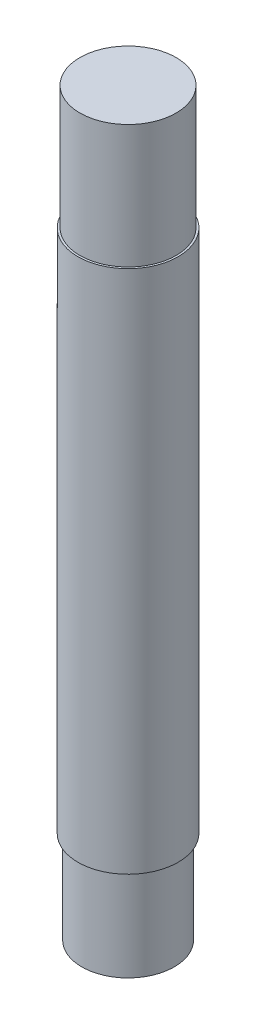
ISO-10303-21;
HEADER;
FILE_DESCRIPTION(('STEP AP214'),'2;1');
FILE_NAME('part.step','',(''),(''),'','','');
FILE_SCHEMA(('AUTOMOTIVE_DESIGN { 1 0 10303 214 1 1 1 1 }'));
ENDSEC;
DATA;
#1=APPLICATION_CONTEXT('core data for automotive mechanical design processes');
#2=APPLICATION_PROTOCOL_DEFINITION('international standard','automotive_design',2000,#1);
#3=PRODUCT_CONTEXT('',#1,'mechanical');
#4=PRODUCT('Part','Part','',(#3));
#5=PRODUCT_RELATED_PRODUCT_CATEGORY('part','',(#4));
#6=PRODUCT_DEFINITION_FORMATION('','',#4);
#7=PRODUCT_DEFINITION_CONTEXT('part definition',#1,'design');
#8=PRODUCT_DEFINITION('design','',#6,#7);
#9=PRODUCT_DEFINITION_SHAPE('','',#8);
#10=(LENGTH_UNIT() NAMED_UNIT(*) SI_UNIT(.MILLI.,.METRE.));
#11=(NAMED_UNIT(*) PLANE_ANGLE_UNIT() SI_UNIT($,.RADIAN.));
#12=(NAMED_UNIT(*) SI_UNIT($,.STERADIAN.) SOLID_ANGLE_UNIT());
#13=UNCERTAINTY_MEASURE_WITH_UNIT(LENGTH_MEASURE(1.E-05),#10,'distance_accuracy_value','');
#14=(GEOMETRIC_REPRESENTATION_CONTEXT(3) GLOBAL_UNCERTAINTY_ASSIGNED_CONTEXT((#13)) GLOBAL_UNIT_ASSIGNED_CONTEXT((#10,
#11,#12)) REPRESENTATION_CONTEXT('',''));
#15=CARTESIAN_POINT('',(0.,0.,0.));
#16=DIRECTION('',(0.,0.,1.));
#17=DIRECTION('',(1.,0.,0.));
#18=AXIS2_PLACEMENT_3D('',#15,#16,#17);
#19=CARTESIAN_POINT('',(0.,76.2,0.));
#20=DIRECTION('',(0.,-1.,0.));
#21=DIRECTION('',(0.,0.,-1.));
#22=AXIS2_PLACEMENT_3D('',#19,#20,#21);
#23=CYLINDRICAL_SURFACE('',#22,5.159375);
#24=CARTESIAN_POINT('',(0.,63.5,0.));
#25=DIRECTION('',(0.,1.,0.));
#26=DIRECTION('',(0.,0.,1.));
#27=AXIS2_PLACEMENT_3D('',#24,#25,#26);
#28=CIRCLE('',#27,5.159375);
#29=CARTESIAN_POINT('',(0.,63.5,5.159375));
#30=VERTEX_POINT('',#29);
#31=EDGE_CURVE('E66',#30,#30,#28,.T.);
#32=ORIENTED_EDGE('',*,*,#31,.F.);
#33=EDGE_LOOP('',(#32));
#34=FACE_BOUND('',#33,.T.);
#35=DIRECTION('',(0.,-1.,0.));
#36=VECTOR('',#35,1.);
#37=CARTESIAN_POINT('',(2.40414753928123,76.2,-4.56499999999923));
#38=LINE('',#37,#36);
#39=CARTESIAN_POINT('',(2.40414753928123,34.4731175956908,-4.56499999999924));
#40=VERTEX_POINT('',#39);
#41=CARTESIAN_POINT('',(2.40414753928123,49.7131175956908,-4.56499999999924));
#42=VERTEX_POINT('',#41);
#43=EDGE_CURVE('E65',#40,#42,#38,.F.);
#44=ORIENTED_EDGE('',*,*,#43,.T.);
#45=CARTESIAN_POINT('',(0.,49.7131175956908,0.));
#46=DIRECTION('',(0.,1.,0.));
#47=DIRECTION('',(0.,0.,1.));
#48=AXIS2_PLACEMENT_3D('',#45,#46,#47);
#49=CIRCLE('',#48,5.159375);
#50=CARTESIAN_POINT('',(-2.40414753928123,49.7131175956908,-4.56499999999924));
#51=VERTEX_POINT('',#50);
#52=EDGE_CURVE('E11',#42,#51,#49,.T.);
#53=ORIENTED_EDGE('',*,*,#52,.T.);
#54=DIRECTION('',(0.,-1.,0.));
#55=VECTOR('',#54,1.);
#56=CARTESIAN_POINT('',(-2.40414753928123,76.2,-4.56499999999923));
#57=LINE('',#56,#55);
#58=CARTESIAN_POINT('',(-2.40414753928123,34.4731175956908,-4.56499999999924));
#59=VERTEX_POINT('',#58);
#60=EDGE_CURVE('E42',#51,#59,#57,.T.);
#61=ORIENTED_EDGE('',*,*,#60,.T.);
#62=CARTESIAN_POINT('',(0.,34.4731175956908,0.));
#63=DIRECTION('',(0.,1.,0.));
#64=DIRECTION('',(0.,0.,1.));
#65=AXIS2_PLACEMENT_3D('',#62,#63,#64);
#66=CIRCLE('',#65,5.159375);
#67=EDGE_CURVE('E61',#40,#59,#66,.T.);
#68=ORIENTED_EDGE('',*,*,#67,.F.);
#69=EDGE_LOOP('',(#44,#53,#61,#68));
#70=FACE_BOUND('',#69,.T.);
#71=CARTESIAN_POINT('',(0.,9.52500000000001,0.));
#72=DIRECTION('',(0.,-1.,0.));
#73=DIRECTION('',(0.,0.,-1.));
#74=AXIS2_PLACEMENT_3D('',#71,#72,#73);
#75=CIRCLE('',#74,5.159375);
#76=CARTESIAN_POINT('',(0.,9.52500000000001,-5.159375));
#77=VERTEX_POINT('',#76);
#78=EDGE_CURVE('E37',#77,#77,#75,.T.);
#79=ORIENTED_EDGE('',*,*,#78,.F.);
#80=EDGE_LOOP('',(#79));
#81=FACE_BOUND('',#80,.T.);
#82=ADVANCED_FACE('F34',(#34,#70,#81),#23,.T.);
#83=CARTESIAN_POINT('',(0.,63.5,0.));
#84=DIRECTION('',(0.,1.,0.));
#85=DIRECTION('',(0.,0.,1.));
#86=AXIS2_PLACEMENT_3D('',#83,#84,#85);
#87=PLANE('',#86);
#88=CARTESIAN_POINT('',(0.,63.5,0.));
#89=DIRECTION('',(0.,1.,0.));
#90=DIRECTION('',(0.,0.,1.));
#91=AXIS2_PLACEMENT_3D('',#88,#89,#90);
#92=CIRCLE('',#91,4.95);
#93=CARTESIAN_POINT('',(0.,63.5,4.95));
#94=VERTEX_POINT('',#93);
#95=EDGE_CURVE('E77',#94,#94,#92,.T.);
#96=ORIENTED_EDGE('',*,*,#95,.F.);
#97=EDGE_LOOP('',(#96));
#98=FACE_BOUND('',#97,.T.);
#99=ORIENTED_EDGE('',*,*,#31,.T.);
#100=EDGE_LOOP('',(#99));
#101=FACE_BOUND('',#100,.T.);
#102=ADVANCED_FACE('F96',(#98,#101),#87,.T.);
#103=CARTESIAN_POINT('',(0.,63.5,0.));
#104=DIRECTION('',(0.,1.,0.));
#105=DIRECTION('',(0.,0.,1.));
#106=AXIS2_PLACEMENT_3D('',#103,#104,#105);
#107=CYLINDRICAL_SURFACE('',#106,4.95);
#108=ORIENTED_EDGE('',*,*,#95,.T.);
#109=EDGE_LOOP('',(#108));
#110=FACE_BOUND('',#109,.T.);
#111=CARTESIAN_POINT('',(0.,76.2,0.));
#112=DIRECTION('',(0.,1.,0.));
#113=DIRECTION('',(0.,0.,1.));
#114=AXIS2_PLACEMENT_3D('',#111,#112,#113);
#115=CIRCLE('',#114,4.95);
#116=CARTESIAN_POINT('',(0.,76.2,4.95));
#117=VERTEX_POINT('',#116);
#118=EDGE_CURVE('E78',#117,#117,#115,.T.);
#119=ORIENTED_EDGE('',*,*,#118,.F.);
#120=EDGE_LOOP('',(#119));
#121=FACE_BOUND('',#120,.T.);
#122=ADVANCED_FACE('F101',(#110,#121),#107,.T.);
#123=CARTESIAN_POINT('',(0.,76.2,0.));
#124=DIRECTION('',(0.,1.,0.));
#125=DIRECTION('',(0.,0.,1.));
#126=AXIS2_PLACEMENT_3D('',#123,#124,#125);
#127=PLANE('',#126);
#128=ORIENTED_EDGE('',*,*,#118,.T.);
#129=EDGE_LOOP('',(#128));
#130=FACE_BOUND('',#129,.T.);
#131=ADVANCED_FACE('F109',(#130),#127,.T.);
#132=CARTESIAN_POINT('',(-2.66453525910038E-12,49.7131175956908,-4.56499999999924));
#133=DIRECTION('',(0.,0.,1.));
#134=DIRECTION('',(0.,-1.,0.));
#135=AXIS2_PLACEMENT_3D('',#132,#133,#134);
#136=PLANE('',#135);
#137=DIRECTION('',(-1.,0.,0.));
#138=VECTOR('',#137,1.);
#139=CARTESIAN_POINT('',(-8.09424218662702,49.7131175956908,-4.56499999999924));
#140=LINE('',#139,#138);
#141=EDGE_CURVE('E69',#42,#51,#140,.T.);
#142=ORIENTED_EDGE('',*,*,#141,.F.);
#143=ORIENTED_EDGE('',*,*,#43,.F.);
#144=DIRECTION('',(-1.,0.,0.));
#145=VECTOR('',#144,1.);
#146=CARTESIAN_POINT('',(-2.66453525910038E-12,34.4731175956908,-4.56499999999924));
#147=LINE('',#146,#145);
#148=EDGE_CURVE('E48',#40,#59,#147,.T.);
#149=ORIENTED_EDGE('',*,*,#148,.T.);
#150=ORIENTED_EDGE('',*,*,#60,.F.);
#151=EDGE_LOOP('',(#142,#143,#149,#150));
#152=FACE_BOUND('',#151,.T.);
#153=ADVANCED_FACE('F68',(#152),#136,.F.);
#154=CARTESIAN_POINT('',(0.,49.7131175956908,0.));
#155=DIRECTION('',(0.,1.,0.));
#156=DIRECTION('',(0.,0.,1.));
#157=AXIS2_PLACEMENT_3D('',#154,#155,#156);
#158=PLANE('',#157);
#159=ORIENTED_EDGE('',*,*,#141,.T.);
#160=ORIENTED_EDGE('',*,*,#52,.F.);
#161=EDGE_LOOP('',(#159,#160));
#162=FACE_BOUND('',#161,.T.);
#163=ADVANCED_FACE('F133',(#162),#158,.F.);
#164=CARTESIAN_POINT('',(0.,34.4731175956908,0.));
#165=DIRECTION('',(0.,1.,0.));
#166=DIRECTION('',(0.,0.,1.));
#167=AXIS2_PLACEMENT_3D('',#164,#165,#166);
#168=PLANE('',#167);
#169=ORIENTED_EDGE('',*,*,#67,.T.);
#170=ORIENTED_EDGE('',*,*,#148,.F.);
#171=EDGE_LOOP('',(#169,#170));
#172=FACE_BOUND('',#171,.T.);
#173=ADVANCED_FACE('F62',(#172),#168,.T.);
#174=CARTESIAN_POINT('',(0.,9.525,0.));
#175=DIRECTION('',(0.,-1.,0.));
#176=DIRECTION('',(0.,0.,-1.));
#177=AXIS2_PLACEMENT_3D('',#174,#175,#176);
#178=PLANE('',#177);
#179=CARTESIAN_POINT('',(0.,9.525,0.));
#180=DIRECTION('',(0.,-1.,0.));
#181=DIRECTION('',(0.,0.,-1.));
#182=AXIS2_PLACEMENT_3D('',#179,#180,#181);
#183=CIRCLE('',#182,4.7625);
#184=CARTESIAN_POINT('',(0.,9.525,-4.7625));
#185=VERTEX_POINT('',#184);
#186=EDGE_CURVE('E87',#185,#185,#183,.T.);
#187=ORIENTED_EDGE('',*,*,#186,.F.);
#188=EDGE_LOOP('',(#187));
#189=FACE_BOUND('',#188,.T.);
#190=ORIENTED_EDGE('',*,*,#78,.T.);
#191=EDGE_LOOP('',(#190));
#192=FACE_BOUND('',#191,.T.);
#193=ADVANCED_FACE('F94',(#189,#192),#178,.T.);
#194=CARTESIAN_POINT('',(0.,9.525,0.));
#195=DIRECTION('',(0.,-1.,0.));
#196=DIRECTION('',(0.,0.,-1.));
#197=AXIS2_PLACEMENT_3D('',#194,#195,#196);
#198=CYLINDRICAL_SURFACE('',#197,4.7625);
#199=CARTESIAN_POINT('',(0.,0.,0.));
#200=DIRECTION('',(0.,-1.,0.));
#201=DIRECTION('',(0.,0.,-1.));
#202=AXIS2_PLACEMENT_3D('',#199,#200,#201);
#203=CIRCLE('',#202,4.7625);
#204=CARTESIAN_POINT('',(0.,0.,-4.7625));
#205=VERTEX_POINT('',#204);
#206=EDGE_CURVE('E84',#205,#205,#203,.T.);
#207=CARTESIAN_POINT('',(0.,9.525,-4.7625));
#208=CARTESIAN_POINT('',(0.,9.42578125,-4.7625));
#209=CARTESIAN_POINT('',(0.,9.3265625,-4.7625));
#210=CARTESIAN_POINT('',(0.,9.128125,-4.7625));
#211=CARTESIAN_POINT('',(0.,9.02890625,-4.7625));
#212=CARTESIAN_POINT('',(0.,8.83046875,-4.7625));
#213=CARTESIAN_POINT('',(0.,8.73125,-4.7625));
#214=CARTESIAN_POINT('',(0.,8.5328125,-4.7625));
#215=CARTESIAN_POINT('',(0.,8.43359375,-4.7625));
#216=CARTESIAN_POINT('',(0.,8.23515625,-4.7625));
#217=CARTESIAN_POINT('',(0.,8.1359375,-4.7625));
#218=CARTESIAN_POINT('',(0.,7.9375,-4.7625));
#219=CARTESIAN_POINT('',(0.,7.83828125,-4.7625));
#220=CARTESIAN_POINT('',(0.,7.63984375,-4.7625));
#221=CARTESIAN_POINT('',(0.,7.540625,-4.7625));
#222=CARTESIAN_POINT('',(0.,7.3421875,-4.7625));
#223=CARTESIAN_POINT('',(0.,7.24296875,-4.7625));
#224=CARTESIAN_POINT('',(0.,7.04453125,-4.7625));
#225=CARTESIAN_POINT('',(0.,6.9453125,-4.7625));
#226=CARTESIAN_POINT('',(0.,6.746875,-4.7625));
#227=CARTESIAN_POINT('',(0.,6.64765625,-4.7625));
#228=CARTESIAN_POINT('',(0.,6.44921875,-4.7625));
#229=CARTESIAN_POINT('',(0.,6.35,-4.7625));
#230=CARTESIAN_POINT('',(0.,6.1515625,-4.7625));
#231=CARTESIAN_POINT('',(0.,6.05234375,-4.7625));
#232=CARTESIAN_POINT('',(0.,5.85390625,-4.7625));
#233=CARTESIAN_POINT('',(0.,5.7546875,-4.7625));
#234=CARTESIAN_POINT('',(0.,5.55625,-4.7625));
#235=CARTESIAN_POINT('',(0.,5.45703125,-4.7625));
#236=CARTESIAN_POINT('',(0.,5.25859375,-4.7625));
#237=CARTESIAN_POINT('',(0.,5.159375,-4.7625));
#238=CARTESIAN_POINT('',(0.,4.9609375,-4.7625));
#239=CARTESIAN_POINT('',(0.,4.86171875,-4.7625));
#240=CARTESIAN_POINT('',(0.,4.66328125,-4.7625));
#241=CARTESIAN_POINT('',(0.,4.5640625,-4.7625));
#242=CARTESIAN_POINT('',(0.,4.365625,-4.7625));
#243=CARTESIAN_POINT('',(0.,4.26640625,-4.7625));
#244=CARTESIAN_POINT('',(0.,4.06796875,-4.7625));
#245=CARTESIAN_POINT('',(0.,3.96875,-4.7625));
#246=CARTESIAN_POINT('',(0.,3.7703125,-4.7625));
#247=CARTESIAN_POINT('',(0.,3.67109375,-4.7625));
#248=CARTESIAN_POINT('',(0.,3.47265625,-4.7625));
#249=CARTESIAN_POINT('',(0.,3.3734375,-4.7625));
#250=CARTESIAN_POINT('',(0.,3.175,-4.7625));
#251=CARTESIAN_POINT('',(0.,3.07578125,-4.7625));
#252=CARTESIAN_POINT('',(0.,2.87734375,-4.7625));
#253=CARTESIAN_POINT('',(0.,2.778125,-4.7625));
#254=CARTESIAN_POINT('',(0.,2.5796875,-4.7625));
#255=CARTESIAN_POINT('',(0.,2.48046875,-4.7625));
#256=CARTESIAN_POINT('',(0.,2.28203125,-4.7625));
#257=CARTESIAN_POINT('',(0.,2.1828125,-4.7625));
#258=CARTESIAN_POINT('',(0.,1.984375,-4.7625));
#259=CARTESIAN_POINT('',(0.,1.88515625,-4.7625));
#260=CARTESIAN_POINT('',(0.,1.68671875,-4.7625));
#261=CARTESIAN_POINT('',(0.,1.5875,-4.7625));
#262=CARTESIAN_POINT('',(0.,1.3890625,-4.7625));
#263=CARTESIAN_POINT('',(0.,1.28984375,-4.7625));
#264=CARTESIAN_POINT('',(0.,1.09140625,-4.7625));
#265=CARTESIAN_POINT('',(0.,0.992187500000001,-4.7625));
#266=CARTESIAN_POINT('',(0.,0.793750000000001,-4.7625));
#267=CARTESIAN_POINT('',(0.,0.69453125,-4.7625));
#268=CARTESIAN_POINT('',(0.,0.49609375,-4.7625));
#269=CARTESIAN_POINT('',(0.,0.396875,-4.7625));
#270=CARTESIAN_POINT('',(0.,0.1984375,-4.7625));
#271=CARTESIAN_POINT('',(0.,0.0992187500000001,-4.7625));
#272=CARTESIAN_POINT('',(0.,0.,-4.7625));
#273=B_SPLINE_CURVE_WITH_KNOTS('',3,(#207,#208,#209,#210,#211,#212,#213,#214,#215,#216,#217,
#218,#219,#220,#221,#222,#223,#224,#225,#226,#227,#228,#229,#230,#231,#232,#233,#234,#235,#236,
#237,#238,#239,#240,#241,#242,#243,#244,#245,#246,#247,#248,#249,#250,#251,#252,#253,#254,#255,
#256,#257,#258,#259,#260,#261,#262,#263,#264,#265,#266,#267,#268,#269,#270,#271,#272),
.UNSPECIFIED.,.F.,.F.,(4,2,2,2,2,2,2,2,2,2,2,2,2,2,2,2,2,2,2,2,2,2,2,2,2,2,2,2,2,2,2,2,4),(0.,
0.297656249999998,0.595312499999999,0.892968749999999,1.190625,1.48828125,1.7859375,2.08359375,
2.38125,2.67890625,2.9765625,3.27421875,3.571875,3.86953125,4.1671875,4.46484375,4.7625,
5.06015625,5.3578125,5.65546875,5.953125,6.25078125,6.5484375,6.84609375,7.14375,7.44140625,
7.7390625,8.03671875,8.334375,8.63203125,8.9296875,9.22734375,9.525),.UNSPECIFIED.);
#274=EDGE_CURVE('BSEAM119',#185,#205,#273,.T.);
#275=ORIENTED_EDGE('',*,*,#186,.T.);
#276=ORIENTED_EDGE('',*,*,#206,.F.);
#277=ORIENTED_EDGE('',*,*,#274,.T.);
#278=ORIENTED_EDGE('',*,*,#274,.F.);
#279=EDGE_LOOP('',(#275,#277,#276,#278));
#280=FACE_BOUND('',#279,.T.);
#281=ADVANCED_FACE('F119',(#280),#198,.T.);
#282=CARTESIAN_POINT('',(0.,0.,0.));
#283=DIRECTION('',(0.,1.,0.));
#284=DIRECTION('',(0.,0.,1.));
#285=AXIS2_PLACEMENT_3D('',#282,#283,#284);
#286=PLANE('',#285);
#287=ORIENTED_EDGE('',*,*,#206,.T.);
#288=EDGE_LOOP('',(#287));
#289=FACE_BOUND('',#288,.T.);
#290=ADVANCED_FACE('F117',(#289),#286,.F.);
#291=CLOSED_SHELL('',(#82,#102,#122,#131,#153,#163,#173,#193,#281,#290));
#292=MANIFOLD_SOLID_BREP('B2',#291);
#293=ADVANCED_BREP_SHAPE_REPRESENTATION('',(#18,#292),#14);
#294=SHAPE_DEFINITION_REPRESENTATION(#9,#293);
ENDSEC;
END-ISO-10303-21;
